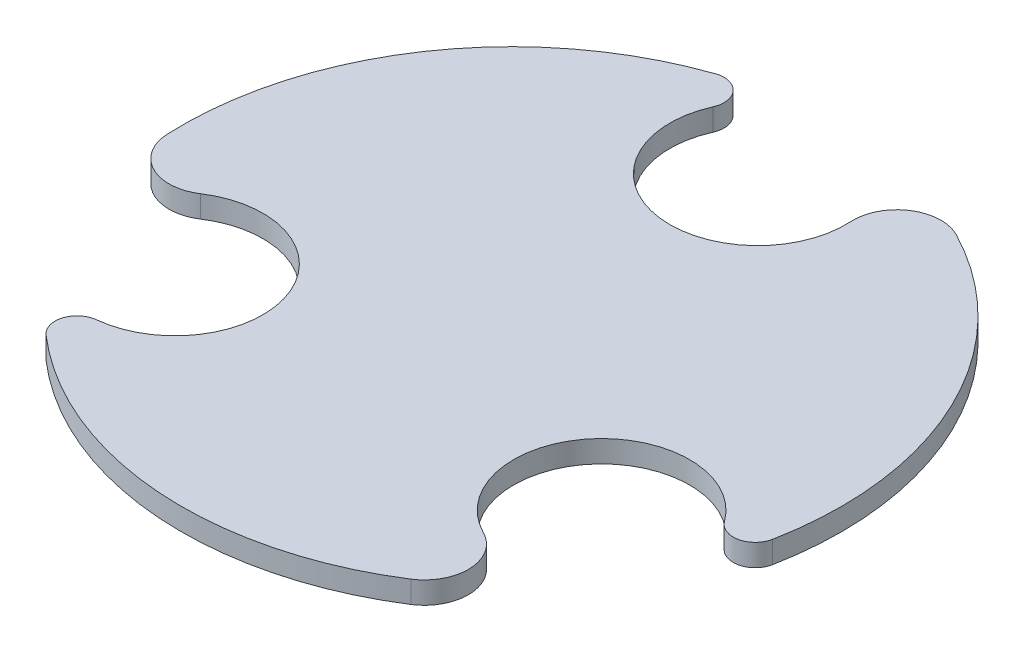
ISO-10303-21;
HEADER;
FILE_DESCRIPTION(('STEP AP214'),'2;1');
FILE_NAME('part.step','',(''),(''),'','','');
FILE_SCHEMA(('AUTOMOTIVE_DESIGN { 1 0 10303 214 1 1 1 1 }'));
ENDSEC;
DATA;
#1=APPLICATION_CONTEXT('core data for automotive mechanical design processes');
#2=APPLICATION_PROTOCOL_DEFINITION('international standard','automotive_design',2000,#1);
#3=PRODUCT_CONTEXT('',#1,'mechanical');
#4=PRODUCT('Part','Part','',(#3));
#5=PRODUCT_RELATED_PRODUCT_CATEGORY('part','',(#4));
#6=PRODUCT_DEFINITION_FORMATION('','',#4);
#7=PRODUCT_DEFINITION_CONTEXT('part definition',#1,'design');
#8=PRODUCT_DEFINITION('design','',#6,#7);
#9=PRODUCT_DEFINITION_SHAPE('','',#8);
#10=(LENGTH_UNIT() NAMED_UNIT(*) SI_UNIT(.MILLI.,.METRE.));
#11=(NAMED_UNIT(*) PLANE_ANGLE_UNIT() SI_UNIT($,.RADIAN.));
#12=(NAMED_UNIT(*) SI_UNIT($,.STERADIAN.) SOLID_ANGLE_UNIT());
#13=UNCERTAINTY_MEASURE_WITH_UNIT(LENGTH_MEASURE(1.E-05),#10,'distance_accuracy_value','');
#14=(GEOMETRIC_REPRESENTATION_CONTEXT(3) GLOBAL_UNCERTAINTY_ASSIGNED_CONTEXT((#13)) GLOBAL_UNIT_ASSIGNED_CONTEXT((#10,
#11,#12)) REPRESENTATION_CONTEXT('',''));
#15=CARTESIAN_POINT('',(0.,0.,0.));
#16=DIRECTION('',(0.,0.,1.));
#17=DIRECTION('',(1.,0.,0.));
#18=AXIS2_PLACEMENT_3D('',#15,#16,#17);
#19=CARTESIAN_POINT('',(0.,5.,0.));
#20=DIRECTION('',(0.,-1.,0.));
#21=DIRECTION('',(0.,0.,-1.));
#22=AXIS2_PLACEMENT_3D('',#19,#20,#21);
#23=CYLINDRICAL_SURFACE('',#22,75.);
#24=CARTESIAN_POINT('',(0.,5.,0.));
#25=DIRECTION('',(0.,1.,0.));
#26=DIRECTION('',(0.,0.,1.));
#27=AXIS2_PLACEMENT_3D('',#24,#25,#26);
#28=CIRCLE('',#27,75.);
#29=CARTESIAN_POINT('',(73.6324679737961,5.,14.2569162194317));
#30=VERTEX_POINT('',#29);
#31=CARTESIAN_POINT('',(34.5605786084377,5.,-66.5625));
#32=VERTEX_POINT('',#31);
#33=EDGE_CURVE('E242',#30,#32,#28,.T.);
#34=ORIENTED_EDGE('',*,*,#33,.F.);
#35=DIRECTION('',(0.,-1.,0.));
#36=VECTOR('',#35,1.);
#37=CARTESIAN_POINT('',(73.6324679737961,5.,14.2569162194317));
#38=LINE('',#37,#36);
#39=CARTESIAN_POINT('',(73.6324679737961,0.,14.2569162194317));
#40=VERTEX_POINT('',#39);
#41=EDGE_CURVE('E54',#30,#40,#38,.T.);
#42=ORIENTED_EDGE('',*,*,#41,.T.);
#43=CARTESIAN_POINT('',(0.,0.,0.));
#44=DIRECTION('',(0.,1.,0.));
#45=DIRECTION('',(0.,0.,1.));
#46=AXIS2_PLACEMENT_3D('',#43,#44,#45);
#47=CIRCLE('',#46,75.);
#48=CARTESIAN_POINT('',(34.5605786084377,0.,-66.5625));
#49=VERTEX_POINT('',#48);
#50=EDGE_CURVE('E150',#40,#49,#47,.T.);
#51=ORIENTED_EDGE('',*,*,#50,.T.);
#52=DIRECTION('',(0.,-1.,0.));
#53=VECTOR('',#52,1.);
#54=CARTESIAN_POINT('',(34.5605786084377,5.,-66.5625));
#55=LINE('',#54,#53);
#56=EDGE_CURVE('E161',#49,#32,#55,.F.);
#57=ORIENTED_EDGE('',*,*,#56,.T.);
#58=EDGE_LOOP('',(#34,#42,#51,#57));
#59=FACE_BOUND('',#58,.T.);
#60=ADVANCED_FACE('F45',(#59),#23,.T.);
#61=CARTESIAN_POINT('',(-49.1630856125523,5.,56.6391296989357));
#62=VERTEX_POINT('',#61);
#63=CARTESIAN_POINT('',(40.3645266351828,5.,63.2115890443961));
#64=VERTEX_POINT('',#63);
#65=EDGE_CURVE('E247',#62,#64,#28,.T.);
#66=ORIENTED_EDGE('',*,*,#65,.F.);
#67=DIRECTION('',(0.,-1.,0.));
#68=VECTOR('',#67,1.);
#69=CARTESIAN_POINT('',(-49.1630856125523,5.,56.6391296989357));
#70=LINE('',#69,#68);
#71=CARTESIAN_POINT('',(-49.1630856125523,0.,56.6391296989357));
#72=VERTEX_POINT('',#71);
#73=EDGE_CURVE('E144',#62,#72,#70,.T.);
#74=ORIENTED_EDGE('',*,*,#73,.T.);
#75=CARTESIAN_POINT('',(40.3645266351828,0.,63.2115890443961));
#76=VERTEX_POINT('',#75);
#77=EDGE_CURVE('E137',#72,#76,#47,.T.);
#78=ORIENTED_EDGE('',*,*,#77,.T.);
#79=DIRECTION('',(0.,-1.,0.));
#80=VECTOR('',#79,1.);
#81=CARTESIAN_POINT('',(40.3645266351828,5.,63.2115890443961));
#82=LINE('',#81,#80);
#83=EDGE_CURVE('E142',#76,#64,#82,.F.);
#84=ORIENTED_EDGE('',*,*,#83,.T.);
#85=EDGE_LOOP('',(#66,#74,#78,#84));
#86=FACE_BOUND('',#85,.T.);
#87=ADVANCED_FACE('F140',(#86),#23,.T.);
#88=CARTESIAN_POINT('',(-24.4693823612438,5.,-70.8960459183674));
#89=VERTEX_POINT('',#88);
#90=CARTESIAN_POINT('',(-74.9251052436205,5.,3.35091095560391));
#91=VERTEX_POINT('',#90);
#92=EDGE_CURVE('E250',#89,#91,#28,.T.);
#93=ORIENTED_EDGE('',*,*,#92,.F.);
#94=DIRECTION('',(0.,-1.,0.));
#95=VECTOR('',#94,1.);
#96=CARTESIAN_POINT('',(-24.4693823612438,5.,-70.8960459183674));
#97=LINE('',#96,#95);
#98=CARTESIAN_POINT('',(-24.4693823612438,0.,-70.8960459183674));
#99=VERTEX_POINT('',#98);
#100=EDGE_CURVE('E210',#89,#99,#97,.T.);
#101=ORIENTED_EDGE('',*,*,#100,.T.);
#102=CARTESIAN_POINT('',(-74.9251052436205,0.,3.35091095560391));
#103=VERTEX_POINT('',#102);
#104=EDGE_CURVE('E147',#99,#103,#47,.T.);
#105=ORIENTED_EDGE('',*,*,#104,.T.);
#106=DIRECTION('',(0.,-1.,0.));
#107=VECTOR('',#106,1.);
#108=CARTESIAN_POINT('',(-74.9251052436206,5.,3.35091095560391));
#109=LINE('',#108,#107);
#110=EDGE_CURVE('E202',#103,#91,#109,.F.);
#111=ORIENTED_EDGE('',*,*,#110,.T.);
#112=EDGE_LOOP('',(#93,#101,#105,#111));
#113=FACE_BOUND('',#112,.T.);
#114=ADVANCED_FACE('F271',(#113),#23,.T.);
#115=CARTESIAN_POINT('',(0.,5.,0.));
#116=DIRECTION('',(0.,1.,0.));
#117=DIRECTION('',(0.,0.,1.));
#118=AXIS2_PLACEMENT_3D('',#115,#116,#117);
#119=PLANE('',#118);
#120=CARTESIAN_POINT('',(0.,5.,-56.));
#121=DIRECTION('',(0.,1.,0.));
#122=DIRECTION('',(0.,0.,1.));
#123=AXIS2_PLACEMENT_3D('',#120,#121,#122);
#124=CIRCLE('',#123,20.);
#125=CARTESIAN_POINT('',(-18.270472163062,5.,-64.1357142857143));
#126=VERTEX_POINT('',#125);
#127=CARTESIAN_POINT('',(19.9683343070973,5.,-57.125));
#128=VERTEX_POINT('',#127);
#129=EDGE_CURVE('E148',#126,#128,#124,.T.);
#130=ORIENTED_EDGE('',*,*,#129,.F.);
#131=CARTESIAN_POINT('',(-22.8380902038275,5.,-66.1696428571429));
#132=DIRECTION('',(0.,1.,0.));
#133=DIRECTION('',(0.,0.,1.));
#134=AXIS2_PLACEMENT_3D('',#131,#132,#133);
#135=CIRCLE('',#134,5.);
#136=EDGE_CURVE('E231',#126,#89,#135,.T.);
#137=ORIENTED_EDGE('',*,*,#136,.T.);
#138=ORIENTED_EDGE('',*,*,#92,.T.);
#139=CARTESIAN_POINT('',(-64.9350912111378,5.,2.90412282819005));
#140=DIRECTION('',(0.,1.,0.));
#141=DIRECTION('',(0.,0.,1.));
#142=AXIS2_PLACEMENT_3D('',#139,#140,#141);
#143=CIRCLE('',#142,10.);
#144=CARTESIAN_POINT('',(-59.4558683447347,5.,11.2694152187934));
#145=VERTEX_POINT('',#144);
#146=EDGE_CURVE('E169',#91,#145,#143,.T.);
#147=ORIENTED_EDGE('',*,*,#146,.T.);
#148=CARTESIAN_POINT('',(-48.4974226119286,5.,28.));
#149=DIRECTION('',(0.,1.,0.));
#150=DIRECTION('',(0.,0.,1.));
#151=AXIS2_PLACEMENT_3D('',#148,#149,#150);
#152=CIRCLE('',#151,20.);
#153=CARTESIAN_POINT('',(-46.4079217797581,5.,47.8905501752053));
#154=VERTEX_POINT('',#153);
#155=EDGE_CURVE('E273',#154,#145,#152,.T.);
#156=ORIENTED_EDGE('',*,*,#155,.F.);
#157=CARTESIAN_POINT('',(-45.8855465717155,5.,52.8631877190066));
#158=DIRECTION('',(0.,1.,0.));
#159=DIRECTION('',(0.,0.,1.));
#160=AXIS2_PLACEMENT_3D('',#157,#158,#159);
#161=CIRCLE('',#160,5.);
#162=EDGE_CURVE('E228',#154,#62,#161,.T.);
#163=ORIENTED_EDGE('',*,*,#162,.T.);
#164=ORIENTED_EDGE('',*,*,#65,.T.);
#165=CARTESIAN_POINT('',(34.9825897504918,5.,54.78337717181));
#166=DIRECTION('',(0.,1.,0.));
#167=DIRECTION('',(0.,0.,1.));
#168=AXIS2_PLACEMENT_3D('',#165,#166,#167);
#169=CIRCLE('',#168,10.);
#170=CARTESIAN_POINT('',(39.4875340376374,5.,45.8555847812066));
#171=VERTEX_POINT('',#170);
#172=EDGE_CURVE('E167',#64,#171,#169,.T.);
#173=ORIENTED_EDGE('',*,*,#172,.T.);
#174=CARTESIAN_POINT('',(48.4974226119286,5.,28.));
#175=DIRECTION('',(0.,1.,0.));
#176=DIRECTION('',(0.,0.,1.));
#177=AXIS2_PLACEMENT_3D('',#174,#175,#176);
#178=CIRCLE('',#177,20.);
#179=CARTESIAN_POINT('',(64.6783939428201,5.,16.245164110509));
#180=VERTEX_POINT('',#179);
#181=EDGE_CURVE('E276',#180,#171,#178,.T.);
#182=ORIENTED_EDGE('',*,*,#181,.F.);
#183=CARTESIAN_POINT('',(68.723636775543,5.,13.3064551381362));
#184=DIRECTION('',(0.,1.,0.));
#185=DIRECTION('',(0.,0.,1.));
#186=AXIS2_PLACEMENT_3D('',#183,#184,#185);
#187=CIRCLE('',#186,5.);
#188=EDGE_CURVE('E69',#180,#30,#187,.T.);
#189=ORIENTED_EDGE('',*,*,#188,.T.);
#190=ORIENTED_EDGE('',*,*,#33,.T.);
#191=CARTESIAN_POINT('',(29.952501460646,5.,-57.6875));
#192=DIRECTION('',(0.,1.,0.));
#193=DIRECTION('',(0.,0.,1.));
#194=AXIS2_PLACEMENT_3D('',#191,#192,#193);
#195=CIRCLE('',#194,10.);
#196=EDGE_CURVE('E175',#32,#128,#195,.T.);
#197=ORIENTED_EDGE('',*,*,#196,.T.);
#198=EDGE_LOOP('',(#130,#137,#138,#147,#156,#163,#164,#173,#182,#189,#190,#197));
#199=FACE_BOUND('',#198,.T.);
#200=ADVANCED_FACE('F262',(#199),#119,.T.);
#201=CARTESIAN_POINT('',(0.,0.,0.));
#202=DIRECTION('',(0.,1.,0.));
#203=DIRECTION('',(0.,0.,1.));
#204=AXIS2_PLACEMENT_3D('',#201,#202,#203);
#205=PLANE('',#204);
#206=ORIENTED_EDGE('',*,*,#104,.F.);
#207=CARTESIAN_POINT('',(-22.8380902038275,0.,-66.1696428571429));
#208=DIRECTION('',(0.,1.,0.));
#209=DIRECTION('',(0.,0.,1.));
#210=AXIS2_PLACEMENT_3D('',#207,#208,#209);
#211=CIRCLE('',#210,5.);
#212=CARTESIAN_POINT('',(-18.270472163062,0.,-64.1357142857143));
#213=VERTEX_POINT('',#212);
#214=EDGE_CURVE('E220',#99,#213,#211,.F.);
#215=ORIENTED_EDGE('',*,*,#214,.T.);
#216=CARTESIAN_POINT('',(0.,0.,-56.));
#217=DIRECTION('',(0.,1.,0.));
#218=DIRECTION('',(0.,0.,1.));
#219=AXIS2_PLACEMENT_3D('',#216,#217,#218);
#220=CIRCLE('',#219,20.);
#221=CARTESIAN_POINT('',(19.9683343070973,0.,-57.125));
#222=VERTEX_POINT('',#221);
#223=EDGE_CURVE('E170',#213,#222,#220,.T.);
#224=ORIENTED_EDGE('',*,*,#223,.T.);
#225=CARTESIAN_POINT('',(29.952501460646,0.,-57.6875));
#226=DIRECTION('',(0.,1.,0.));
#227=DIRECTION('',(0.,0.,1.));
#228=AXIS2_PLACEMENT_3D('',#225,#226,#227);
#229=CIRCLE('',#228,10.);
#230=EDGE_CURVE('E162',#222,#49,#229,.F.);
#231=ORIENTED_EDGE('',*,*,#230,.T.);
#232=ORIENTED_EDGE('',*,*,#50,.F.);
#233=CARTESIAN_POINT('',(68.723636775543,0.,13.3064551381362));
#234=DIRECTION('',(0.,1.,0.));
#235=DIRECTION('',(0.,0.,1.));
#236=AXIS2_PLACEMENT_3D('',#233,#234,#235);
#237=CIRCLE('',#236,5.);
#238=CARTESIAN_POINT('',(64.6783939428201,0.,16.245164110509));
#239=VERTEX_POINT('',#238);
#240=EDGE_CURVE('E214',#40,#239,#237,.F.);
#241=ORIENTED_EDGE('',*,*,#240,.T.);
#242=CARTESIAN_POINT('',(48.4974226119286,0.,28.));
#243=DIRECTION('',(0.,1.,0.));
#244=DIRECTION('',(0.,0.,1.));
#245=AXIS2_PLACEMENT_3D('',#242,#243,#244);
#246=CIRCLE('',#245,20.);
#247=CARTESIAN_POINT('',(39.4875340376374,0.,45.8555847812066));
#248=VERTEX_POINT('',#247);
#249=EDGE_CURVE('E156',#239,#248,#246,.T.);
#250=ORIENTED_EDGE('',*,*,#249,.T.);
#251=CARTESIAN_POINT('',(34.9825897504918,0.,54.78337717181));
#252=DIRECTION('',(0.,1.,0.));
#253=DIRECTION('',(0.,0.,1.));
#254=AXIS2_PLACEMENT_3D('',#251,#252,#253);
#255=CIRCLE('',#254,10.);
#256=EDGE_CURVE('E152',#248,#76,#255,.F.);
#257=ORIENTED_EDGE('',*,*,#256,.T.);
#258=ORIENTED_EDGE('',*,*,#77,.F.);
#259=CARTESIAN_POINT('',(-45.8855465717155,0.,52.8631877190066));
#260=DIRECTION('',(0.,1.,0.));
#261=DIRECTION('',(0.,0.,1.));
#262=AXIS2_PLACEMENT_3D('',#259,#260,#261);
#263=CIRCLE('',#262,5.);
#264=CARTESIAN_POINT('',(-46.4079217797581,0.,47.8905501752053));
#265=VERTEX_POINT('',#264);
#266=EDGE_CURVE('E217',#72,#265,#263,.F.);
#267=ORIENTED_EDGE('',*,*,#266,.T.);
#268=CARTESIAN_POINT('',(-48.4974226119286,0.,28.));
#269=DIRECTION('',(0.,1.,0.));
#270=DIRECTION('',(0.,0.,1.));
#271=AXIS2_PLACEMENT_3D('',#268,#269,#270);
#272=CIRCLE('',#271,20.);
#273=CARTESIAN_POINT('',(-59.4558683447347,0.,11.2694152187934));
#274=VERTEX_POINT('',#273);
#275=EDGE_CURVE('E254',#265,#274,#272,.T.);
#276=ORIENTED_EDGE('',*,*,#275,.T.);
#277=CARTESIAN_POINT('',(-64.9350912111378,0.,2.90412282819005));
#278=DIRECTION('',(0.,1.,0.));
#279=DIRECTION('',(0.,0.,1.));
#280=AXIS2_PLACEMENT_3D('',#277,#278,#279);
#281=CIRCLE('',#280,10.);
#282=EDGE_CURVE('E188',#274,#103,#281,.F.);
#283=ORIENTED_EDGE('',*,*,#282,.T.);
#284=EDGE_LOOP('',(#206,#215,#224,#231,#232,#241,#250,#257,#258,#267,#276,#283));
#285=FACE_BOUND('',#284,.T.);
#286=ADVANCED_FACE('F154',(#285),#205,.F.);
#287=CARTESIAN_POINT('',(-48.4974226119286,0.,28.));
#288=DIRECTION('',(0.,1.,0.));
#289=DIRECTION('',(0.,0.,1.));
#290=AXIS2_PLACEMENT_3D('',#287,#288,#289);
#291=CYLINDRICAL_SURFACE('',#290,20.);
#292=ORIENTED_EDGE('',*,*,#275,.F.);
#293=DIRECTION('',(0.,1.,0.));
#294=VECTOR('',#293,1.);
#295=CARTESIAN_POINT('',(-46.4079217797581,0.,47.8905501752053));
#296=LINE('',#295,#294);
#297=EDGE_CURVE('E61',#265,#154,#296,.T.);
#298=ORIENTED_EDGE('',*,*,#297,.T.);
#299=ORIENTED_EDGE('',*,*,#155,.T.);
#300=DIRECTION('',(0.,1.,0.));
#301=VECTOR('',#300,1.);
#302=CARTESIAN_POINT('',(-59.4558683447347,0.,11.2694152187934));
#303=LINE('',#302,#301);
#304=EDGE_CURVE('E206',#145,#274,#303,.F.);
#305=ORIENTED_EDGE('',*,*,#304,.T.);
#306=EDGE_LOOP('',(#292,#298,#299,#305));
#307=FACE_BOUND('',#306,.T.);
#308=ADVANCED_FACE('F272',(#307),#291,.F.);
#309=CARTESIAN_POINT('',(48.4974226119286,0.,28.));
#310=DIRECTION('',(0.,1.,0.));
#311=DIRECTION('',(0.,0.,1.));
#312=AXIS2_PLACEMENT_3D('',#309,#310,#311);
#313=CYLINDRICAL_SURFACE('',#312,20.);
#314=ORIENTED_EDGE('',*,*,#249,.F.);
#315=DIRECTION('',(0.,1.,0.));
#316=VECTOR('',#315,1.);
#317=CARTESIAN_POINT('',(64.6783939428201,0.,16.245164110509));
#318=LINE('',#317,#316);
#319=EDGE_CURVE('E11',#239,#180,#318,.T.);
#320=ORIENTED_EDGE('',*,*,#319,.T.);
#321=ORIENTED_EDGE('',*,*,#181,.T.);
#322=DIRECTION('',(0.,1.,0.));
#323=VECTOR('',#322,1.);
#324=CARTESIAN_POINT('',(39.4875340376374,0.,45.8555847812066));
#325=LINE('',#324,#323);
#326=EDGE_CURVE('E185',#171,#248,#325,.F.);
#327=ORIENTED_EDGE('',*,*,#326,.T.);
#328=EDGE_LOOP('',(#314,#320,#321,#327));
#329=FACE_BOUND('',#328,.T.);
#330=ADVANCED_FACE('F315',(#329),#313,.F.);
#331=CARTESIAN_POINT('',(0.,0.,-56.));
#332=DIRECTION('',(0.,1.,0.));
#333=DIRECTION('',(0.,0.,1.));
#334=AXIS2_PLACEMENT_3D('',#331,#332,#333);
#335=CYLINDRICAL_SURFACE('',#334,20.);
#336=ORIENTED_EDGE('',*,*,#223,.F.);
#337=DIRECTION('',(0.,1.,0.));
#338=VECTOR('',#337,1.);
#339=CARTESIAN_POINT('',(-18.270472163062,0.,-64.1357142857143));
#340=LINE('',#339,#338);
#341=EDGE_CURVE('E223',#213,#126,#340,.T.);
#342=ORIENTED_EDGE('',*,*,#341,.T.);
#343=ORIENTED_EDGE('',*,*,#129,.T.);
#344=DIRECTION('',(0.,1.,0.));
#345=VECTOR('',#344,1.);
#346=CARTESIAN_POINT('',(19.9683343070973,0.,-57.125));
#347=LINE('',#346,#345);
#348=EDGE_CURVE('E198',#128,#222,#347,.F.);
#349=ORIENTED_EDGE('',*,*,#348,.T.);
#350=EDGE_LOOP('',(#336,#342,#343,#349));
#351=FACE_BOUND('',#350,.T.);
#352=ADVANCED_FACE('F283',(#351),#335,.F.);
#353=CARTESIAN_POINT('',(34.9825897504918,0.,54.78337717181));
#354=DIRECTION('',(0.,-1.,0.));
#355=DIRECTION('',(0.,0.,-1.));
#356=AXIS2_PLACEMENT_3D('',#353,#354,#355);
#357=CYLINDRICAL_SURFACE('',#356,10.);
#358=ORIENTED_EDGE('',*,*,#256,.F.);
#359=ORIENTED_EDGE('',*,*,#326,.F.);
#360=ORIENTED_EDGE('',*,*,#172,.F.);
#361=ORIENTED_EDGE('',*,*,#83,.F.);
#362=EDGE_LOOP('',(#358,#359,#360,#361));
#363=FACE_BOUND('',#362,.T.);
#364=ADVANCED_FACE('F165',(#363),#357,.T.);
#365=CARTESIAN_POINT('',(29.952501460646,0.,-57.6875));
#366=DIRECTION('',(0.,-1.,0.));
#367=DIRECTION('',(0.,0.,-1.));
#368=AXIS2_PLACEMENT_3D('',#365,#366,#367);
#369=CYLINDRICAL_SURFACE('',#368,10.);
#370=ORIENTED_EDGE('',*,*,#230,.F.);
#371=ORIENTED_EDGE('',*,*,#348,.F.);
#372=ORIENTED_EDGE('',*,*,#196,.F.);
#373=ORIENTED_EDGE('',*,*,#56,.F.);
#374=EDGE_LOOP('',(#370,#371,#372,#373));
#375=FACE_BOUND('',#374,.T.);
#376=ADVANCED_FACE('F288',(#375),#369,.T.);
#377=CARTESIAN_POINT('',(-64.9350912111378,0.,2.90412282819005));
#378=DIRECTION('',(0.,-1.,0.));
#379=DIRECTION('',(0.,0.,-1.));
#380=AXIS2_PLACEMENT_3D('',#377,#378,#379);
#381=CYLINDRICAL_SURFACE('',#380,10.);
#382=ORIENTED_EDGE('',*,*,#282,.F.);
#383=ORIENTED_EDGE('',*,*,#304,.F.);
#384=ORIENTED_EDGE('',*,*,#146,.F.);
#385=ORIENTED_EDGE('',*,*,#110,.F.);
#386=EDGE_LOOP('',(#382,#383,#384,#385));
#387=FACE_BOUND('',#386,.T.);
#388=ADVANCED_FACE('F270',(#387),#381,.T.);
#389=CARTESIAN_POINT('',(-22.8380902038275,0.,-66.1696428571429));
#390=DIRECTION('',(0.,1.,0.));
#391=DIRECTION('',(0.,0.,1.));
#392=AXIS2_PLACEMENT_3D('',#389,#390,#391);
#393=CYLINDRICAL_SURFACE('',#392,5.);
#394=ORIENTED_EDGE('',*,*,#136,.F.);
#395=ORIENTED_EDGE('',*,*,#341,.F.);
#396=ORIENTED_EDGE('',*,*,#214,.F.);
#397=ORIENTED_EDGE('',*,*,#100,.F.);
#398=EDGE_LOOP('',(#394,#395,#396,#397));
#399=FACE_BOUND('',#398,.T.);
#400=ADVANCED_FACE('F295',(#399),#393,.T.);
#401=CARTESIAN_POINT('',(-45.8855465717155,0.,52.8631877190066));
#402=DIRECTION('',(0.,1.,0.));
#403=DIRECTION('',(0.,0.,1.));
#404=AXIS2_PLACEMENT_3D('',#401,#402,#403);
#405=CYLINDRICAL_SURFACE('',#404,5.);
#406=ORIENTED_EDGE('',*,*,#162,.F.);
#407=ORIENTED_EDGE('',*,*,#297,.F.);
#408=ORIENTED_EDGE('',*,*,#266,.F.);
#409=ORIENTED_EDGE('',*,*,#73,.F.);
#410=EDGE_LOOP('',(#406,#407,#408,#409));
#411=FACE_BOUND('',#410,.T.);
#412=ADVANCED_FACE('F332',(#411),#405,.T.);
#413=CARTESIAN_POINT('',(68.723636775543,0.,13.3064551381362));
#414=DIRECTION('',(0.,1.,0.));
#415=DIRECTION('',(0.,0.,1.));
#416=AXIS2_PLACEMENT_3D('',#413,#414,#415);
#417=CYLINDRICAL_SURFACE('',#416,5.);
#418=ORIENTED_EDGE('',*,*,#188,.F.);
#419=ORIENTED_EDGE('',*,*,#319,.F.);
#420=ORIENTED_EDGE('',*,*,#240,.F.);
#421=ORIENTED_EDGE('',*,*,#41,.F.);
#422=EDGE_LOOP('',(#418,#419,#420,#421));
#423=FACE_BOUND('',#422,.T.);
#424=ADVANCED_FACE('F47',(#423),#417,.T.);
#425=CLOSED_SHELL('',(#60,#87,#114,#200,#286,#308,#330,#352,#364,#376,#388,#400,#412,#424));
#426=MANIFOLD_SOLID_BREP('B2',#425);
#427=ADVANCED_BREP_SHAPE_REPRESENTATION('',(#18,#426),#14);
#428=SHAPE_DEFINITION_REPRESENTATION(#9,#427);
ENDSEC;
END-ISO-10303-21;
